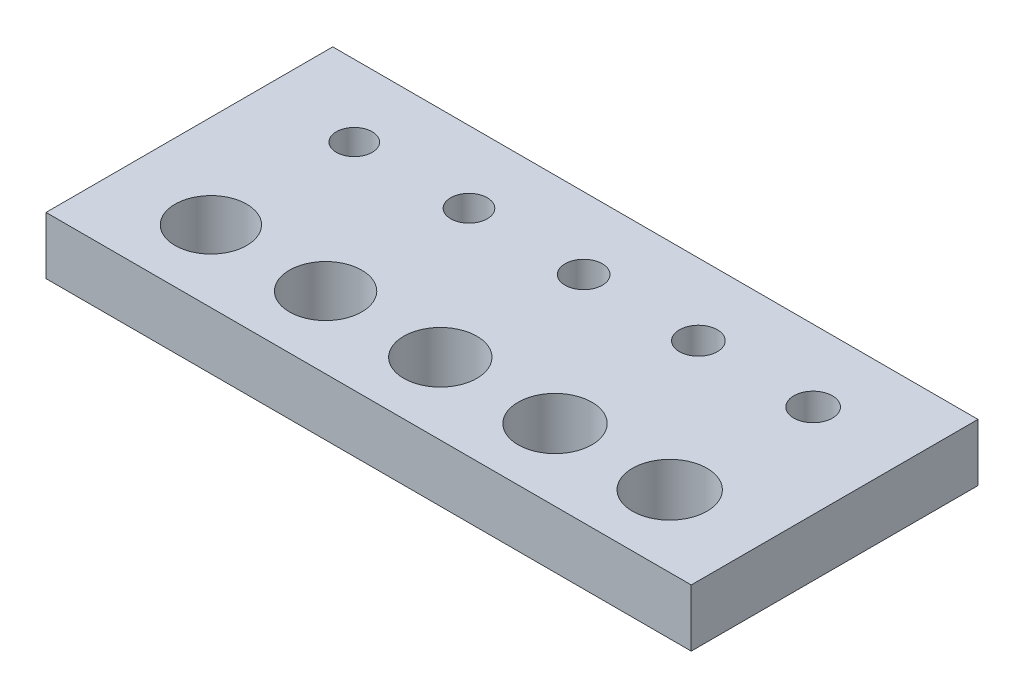
ISO-10303-21;
HEADER;
FILE_DESCRIPTION(('STEP AP214'),'2;1');
FILE_NAME('part.step','',(''),(''),'','','');
FILE_SCHEMA(('AUTOMOTIVE_DESIGN { 1 0 10303 214 1 1 1 1 }'));
ENDSEC;
DATA;
#1=APPLICATION_CONTEXT('core data for automotive mechanical design processes');
#2=APPLICATION_PROTOCOL_DEFINITION('international standard','automotive_design',2000,#1);
#3=PRODUCT_CONTEXT('',#1,'mechanical');
#4=PRODUCT('Part','Part','',(#3));
#5=PRODUCT_RELATED_PRODUCT_CATEGORY('part','',(#4));
#6=PRODUCT_DEFINITION_FORMATION('','',#4);
#7=PRODUCT_DEFINITION_CONTEXT('part definition',#1,'design');
#8=PRODUCT_DEFINITION('design','',#6,#7);
#9=PRODUCT_DEFINITION_SHAPE('','',#8);
#10=(LENGTH_UNIT() NAMED_UNIT(*) SI_UNIT(.MILLI.,.METRE.));
#11=(NAMED_UNIT(*) PLANE_ANGLE_UNIT() SI_UNIT($,.RADIAN.));
#12=(NAMED_UNIT(*) SI_UNIT($,.STERADIAN.) SOLID_ANGLE_UNIT());
#13=UNCERTAINTY_MEASURE_WITH_UNIT(LENGTH_MEASURE(1.E-05),#10,'distance_accuracy_value','');
#14=(GEOMETRIC_REPRESENTATION_CONTEXT(3) GLOBAL_UNCERTAINTY_ASSIGNED_CONTEXT((#13)) GLOBAL_UNIT_ASSIGNED_CONTEXT((#10,
#11,#12)) REPRESENTATION_CONTEXT('',''));
#15=CARTESIAN_POINT('',(0.,0.,0.));
#16=DIRECTION('',(0.,0.,1.));
#17=DIRECTION('',(1.,0.,0.));
#18=AXIS2_PLACEMENT_3D('',#15,#16,#17);
#19=CARTESIAN_POINT('',(-45.,8.,20.));
#20=DIRECTION('',(1.,0.,0.));
#21=DIRECTION('',(0.,0.,-1.));
#22=AXIS2_PLACEMENT_3D('',#19,#20,#21);
#23=PLANE('',#22);
#24=DIRECTION('',(0.,0.,1.));
#25=VECTOR('',#24,1.);
#26=CARTESIAN_POINT('',(-45.,0.,20.));
#27=LINE('',#26,#25);
#28=CARTESIAN_POINT('',(-45.,0.,-20.));
#29=VERTEX_POINT('',#28);
#30=CARTESIAN_POINT('',(-45.,0.,20.));
#31=VERTEX_POINT('',#30);
#32=EDGE_CURVE('E109',#29,#31,#27,.T.);
#33=ORIENTED_EDGE('',*,*,#32,.T.);
#34=DIRECTION('',(0.,-1.,0.));
#35=VECTOR('',#34,1.);
#36=CARTESIAN_POINT('',(-45.,8.,20.));
#37=LINE('',#36,#35);
#38=CARTESIAN_POINT('',(-45.,8.,20.));
#39=VERTEX_POINT('',#38);
#40=EDGE_CURVE('E101',#39,#31,#37,.T.);
#41=ORIENTED_EDGE('',*,*,#40,.F.);
#42=DIRECTION('',(0.,0.,1.));
#43=VECTOR('',#42,1.);
#44=CARTESIAN_POINT('',(-45.,8.,20.));
#45=LINE('',#44,#43);
#46=CARTESIAN_POINT('',(-45.,8.,-20.));
#47=VERTEX_POINT('',#46);
#48=EDGE_CURVE('E92',#47,#39,#45,.T.);
#49=ORIENTED_EDGE('',*,*,#48,.F.);
#50=DIRECTION('',(0.,-1.,0.));
#51=VECTOR('',#50,1.);
#52=CARTESIAN_POINT('',(-45.,8.,-20.));
#53=LINE('',#52,#51);
#54=EDGE_CURVE('E106',#47,#29,#53,.T.);
#55=ORIENTED_EDGE('',*,*,#54,.T.);
#56=EDGE_LOOP('',(#33,#41,#49,#55));
#57=FACE_BOUND('',#56,.T.);
#58=ADVANCED_FACE('F41',(#57),#23,.F.);
#59=CARTESIAN_POINT('',(45.,8.,20.));
#60=DIRECTION('',(0.,0.,-1.));
#61=DIRECTION('',(-1.,0.,0.));
#62=AXIS2_PLACEMENT_3D('',#59,#60,#61);
#63=PLANE('',#62);
#64=DIRECTION('',(1.,0.,0.));
#65=VECTOR('',#64,1.);
#66=CARTESIAN_POINT('',(45.,0.,20.));
#67=LINE('',#66,#65);
#68=CARTESIAN_POINT('',(45.,0.,20.));
#69=VERTEX_POINT('',#68);
#70=EDGE_CURVE('E99',#31,#69,#67,.T.);
#71=ORIENTED_EDGE('',*,*,#70,.T.);
#72=DIRECTION('',(0.,-1.,0.));
#73=VECTOR('',#72,1.);
#74=CARTESIAN_POINT('',(45.,8.,20.));
#75=LINE('',#74,#73);
#76=CARTESIAN_POINT('',(45.,8.,20.));
#77=VERTEX_POINT('',#76);
#78=EDGE_CURVE('E98',#77,#69,#75,.T.);
#79=ORIENTED_EDGE('',*,*,#78,.F.);
#80=DIRECTION('',(1.,0.,0.));
#81=VECTOR('',#80,1.);
#82=CARTESIAN_POINT('',(45.,8.,20.));
#83=LINE('',#82,#81);
#84=EDGE_CURVE('E89',#39,#77,#83,.T.);
#85=ORIENTED_EDGE('',*,*,#84,.F.);
#86=ORIENTED_EDGE('',*,*,#40,.T.);
#87=EDGE_LOOP('',(#71,#79,#85,#86));
#88=FACE_BOUND('',#87,.T.);
#89=ADVANCED_FACE('F97',(#88),#63,.F.);
#90=CARTESIAN_POINT('',(45.,8.,20.));
#91=DIRECTION('',(-1.,0.,0.));
#92=DIRECTION('',(0.,0.,1.));
#93=AXIS2_PLACEMENT_3D('',#90,#91,#92);
#94=PLANE('',#93);
#95=DIRECTION('',(0.,0.,-1.));
#96=VECTOR('',#95,1.);
#97=CARTESIAN_POINT('',(45.,0.,20.));
#98=LINE('',#97,#96);
#99=CARTESIAN_POINT('',(45.,0.,-20.));
#100=VERTEX_POINT('',#99);
#101=EDGE_CURVE('E77',#69,#100,#98,.T.);
#102=ORIENTED_EDGE('',*,*,#101,.T.);
#103=DIRECTION('',(0.,-1.,0.));
#104=VECTOR('',#103,1.);
#105=CARTESIAN_POINT('',(45.,8.,-20.));
#106=LINE('',#105,#104);
#107=CARTESIAN_POINT('',(45.,8.,-20.));
#108=VERTEX_POINT('',#107);
#109=EDGE_CURVE('E105',#108,#100,#106,.T.);
#110=ORIENTED_EDGE('',*,*,#109,.F.);
#111=DIRECTION('',(0.,0.,-1.));
#112=VECTOR('',#111,1.);
#113=CARTESIAN_POINT('',(45.,8.,20.));
#114=LINE('',#113,#112);
#115=EDGE_CURVE('E91',#77,#108,#114,.T.);
#116=ORIENTED_EDGE('',*,*,#115,.F.);
#117=ORIENTED_EDGE('',*,*,#78,.T.);
#118=EDGE_LOOP('',(#102,#110,#116,#117));
#119=FACE_BOUND('',#118,.T.);
#120=ADVANCED_FACE('F102',(#119),#94,.F.);
#121=CARTESIAN_POINT('',(45.,8.,-20.));
#122=DIRECTION('',(0.,0.,1.));
#123=DIRECTION('',(1.,0.,0.));
#124=AXIS2_PLACEMENT_3D('',#121,#122,#123);
#125=PLANE('',#124);
#126=DIRECTION('',(-1.,0.,0.));
#127=VECTOR('',#126,1.);
#128=CARTESIAN_POINT('',(45.,0.,-20.));
#129=LINE('',#128,#127);
#130=EDGE_CURVE('E85',#100,#29,#129,.T.);
#131=ORIENTED_EDGE('',*,*,#130,.T.);
#132=ORIENTED_EDGE('',*,*,#54,.F.);
#133=DIRECTION('',(-1.,0.,0.));
#134=VECTOR('',#133,1.);
#135=CARTESIAN_POINT('',(45.,8.,-20.));
#136=LINE('',#135,#134);
#137=EDGE_CURVE('E56',#108,#47,#136,.T.);
#138=ORIENTED_EDGE('',*,*,#137,.F.);
#139=ORIENTED_EDGE('',*,*,#109,.T.);
#140=EDGE_LOOP('',(#131,#132,#138,#139));
#141=FACE_BOUND('',#140,.T.);
#142=ADVANCED_FACE('F191',(#141),#125,.F.);
#143=CARTESIAN_POINT('',(0.,8.,0.));
#144=DIRECTION('',(0.,1.,0.));
#145=DIRECTION('',(0.,0.,1.));
#146=AXIS2_PLACEMENT_3D('',#143,#144,#145);
#147=PLANE('',#146);
#148=CARTESIAN_POINT('',(-16.,8.,-10.));
#149=DIRECTION('',(0.,1.,0.));
#150=DIRECTION('',(0.,0.,1.));
#151=AXIS2_PLACEMENT_3D('',#148,#149,#150);
#152=CIRCLE('',#151,2.55);
#153=CARTESIAN_POINT('',(-16.,8.,-7.45));
#154=VERTEX_POINT('',#153);
#155=EDGE_CURVE('E298',#154,#154,#152,.T.);
#156=ORIENTED_EDGE('',*,*,#155,.F.);
#157=EDGE_LOOP('',(#156));
#158=FACE_BOUND('',#157,.T.);
#159=CARTESIAN_POINT('',(0.,8.,-10.));
#160=DIRECTION('',(0.,1.,0.));
#161=DIRECTION('',(0.,0.,1.));
#162=AXIS2_PLACEMENT_3D('',#159,#160,#161);
#163=CIRCLE('',#162,2.6);
#164=CARTESIAN_POINT('',(0.,8.,-7.4));
#165=VERTEX_POINT('',#164);
#166=EDGE_CURVE('E304',#165,#165,#163,.T.);
#167=ORIENTED_EDGE('',*,*,#166,.F.);
#168=EDGE_LOOP('',(#167));
#169=FACE_BOUND('',#168,.T.);
#170=CARTESIAN_POINT('',(16.,8.,-10.));
#171=DIRECTION('',(0.,1.,0.));
#172=DIRECTION('',(0.,0.,1.));
#173=AXIS2_PLACEMENT_3D('',#170,#171,#172);
#174=CIRCLE('',#173,2.65);
#175=CARTESIAN_POINT('',(16.,8.,-7.35));
#176=VERTEX_POINT('',#175);
#177=EDGE_CURVE('E310',#176,#176,#174,.T.);
#178=ORIENTED_EDGE('',*,*,#177,.F.);
#179=EDGE_LOOP('',(#178));
#180=FACE_BOUND('',#179,.T.);
#181=CARTESIAN_POINT('',(32.,8.,-10.));
#182=DIRECTION('',(0.,1.,0.));
#183=DIRECTION('',(0.,0.,1.));
#184=AXIS2_PLACEMENT_3D('',#181,#182,#183);
#185=CIRCLE('',#184,2.7);
#186=CARTESIAN_POINT('',(32.,8.,-7.3));
#187=VERTEX_POINT('',#186);
#188=EDGE_CURVE('E312',#187,#187,#185,.T.);
#189=ORIENTED_EDGE('',*,*,#188,.F.);
#190=EDGE_LOOP('',(#189));
#191=FACE_BOUND('',#190,.T.);
#192=CARTESIAN_POINT('',(-32.,8.,10.));
#193=DIRECTION('',(0.,1.,0.));
#194=DIRECTION('',(0.,0.,1.));
#195=AXIS2_PLACEMENT_3D('',#192,#193,#194);
#196=CIRCLE('',#195,5.);
#197=CARTESIAN_POINT('',(-32.,8.,15.));
#198=VERTEX_POINT('',#197);
#199=EDGE_CURVE('E295',#198,#198,#196,.T.);
#200=ORIENTED_EDGE('',*,*,#199,.F.);
#201=EDGE_LOOP('',(#200));
#202=FACE_BOUND('',#201,.T.);
#203=CARTESIAN_POINT('',(-16.,8.,10.));
#204=DIRECTION('',(0.,1.,0.));
#205=DIRECTION('',(0.,0.,1.));
#206=AXIS2_PLACEMENT_3D('',#203,#204,#205);
#207=CIRCLE('',#206,5.05);
#208=CARTESIAN_POINT('',(-16.,8.,15.05));
#209=VERTEX_POINT('',#208);
#210=EDGE_CURVE('E288',#209,#209,#207,.T.);
#211=ORIENTED_EDGE('',*,*,#210,.F.);
#212=EDGE_LOOP('',(#211));
#213=FACE_BOUND('',#212,.T.);
#214=CARTESIAN_POINT('',(0.,8.,10.));
#215=DIRECTION('',(0.,1.,0.));
#216=DIRECTION('',(0.,0.,1.));
#217=AXIS2_PLACEMENT_3D('',#214,#215,#216);
#218=CIRCLE('',#217,5.1);
#219=CARTESIAN_POINT('',(0.,8.,15.1));
#220=VERTEX_POINT('',#219);
#221=EDGE_CURVE('E287',#220,#220,#218,.T.);
#222=ORIENTED_EDGE('',*,*,#221,.F.);
#223=EDGE_LOOP('',(#222));
#224=FACE_BOUND('',#223,.T.);
#225=CARTESIAN_POINT('',(16.,8.,10.));
#226=DIRECTION('',(0.,1.,0.));
#227=DIRECTION('',(0.,0.,1.));
#228=AXIS2_PLACEMENT_3D('',#225,#226,#227);
#229=CIRCLE('',#228,5.15);
#230=CARTESIAN_POINT('',(16.,8.,15.15));
#231=VERTEX_POINT('',#230);
#232=EDGE_CURVE('E289',#231,#231,#229,.T.);
#233=ORIENTED_EDGE('',*,*,#232,.F.);
#234=EDGE_LOOP('',(#233));
#235=FACE_BOUND('',#234,.T.);
#236=CARTESIAN_POINT('',(32.,8.,10.));
#237=DIRECTION('',(0.,1.,0.));
#238=DIRECTION('',(0.,0.,1.));
#239=AXIS2_PLACEMENT_3D('',#236,#237,#238);
#240=CIRCLE('',#239,5.2);
#241=CARTESIAN_POINT('',(32.,8.,15.2));
#242=VERTEX_POINT('',#241);
#243=EDGE_CURVE('E293',#242,#242,#240,.T.);
#244=ORIENTED_EDGE('',*,*,#243,.F.);
#245=EDGE_LOOP('',(#244));
#246=FACE_BOUND('',#245,.T.);
#247=CARTESIAN_POINT('',(-32.,8.,-10.));
#248=DIRECTION('',(0.,1.,0.));
#249=DIRECTION('',(0.,0.,1.));
#250=AXIS2_PLACEMENT_3D('',#247,#248,#249);
#251=CIRCLE('',#250,2.5);
#252=CARTESIAN_POINT('',(-32.,8.,-7.5));
#253=VERTEX_POINT('',#252);
#254=EDGE_CURVE('E114',#253,#253,#251,.T.);
#255=ORIENTED_EDGE('',*,*,#254,.F.);
#256=EDGE_LOOP('',(#255));
#257=FACE_BOUND('',#256,.T.);
#258=ORIENTED_EDGE('',*,*,#48,.T.);
#259=ORIENTED_EDGE('',*,*,#84,.T.);
#260=ORIENTED_EDGE('',*,*,#115,.T.);
#261=ORIENTED_EDGE('',*,*,#137,.T.);
#262=EDGE_LOOP('',(#258,#259,#260,#261));
#263=FACE_BOUND('',#262,.T.);
#264=ADVANCED_FACE('F93',(#158,#169,#180,#191,#202,#213,#224,#235,#246,#257,#263),#147,.T.);
#265=CARTESIAN_POINT('',(0.,0.,0.));
#266=DIRECTION('',(0.,1.,0.));
#267=DIRECTION('',(0.,0.,1.));
#268=AXIS2_PLACEMENT_3D('',#265,#266,#267);
#269=PLANE('',#268);
#270=CARTESIAN_POINT('',(-32.,0.,-10.));
#271=DIRECTION('',(0.,1.,0.));
#272=DIRECTION('',(0.,0.,1.));
#273=AXIS2_PLACEMENT_3D('',#270,#271,#272);
#274=CIRCLE('',#273,3.);
#275=CARTESIAN_POINT('',(-32.,0.,-7.));
#276=VERTEX_POINT('',#275);
#277=EDGE_CURVE('E150',#276,#276,#274,.T.);
#278=ORIENTED_EDGE('',*,*,#277,.T.);
#279=EDGE_LOOP('',(#278));
#280=FACE_BOUND('',#279,.T.);
#281=CARTESIAN_POINT('',(-16.,0.,-10.));
#282=DIRECTION('',(0.,1.,0.));
#283=DIRECTION('',(0.,0.,1.));
#284=AXIS2_PLACEMENT_3D('',#281,#282,#283);
#285=CIRCLE('',#284,3.05000000000001);
#286=CARTESIAN_POINT('',(-16.,0.,-6.94999999999999));
#287=VERTEX_POINT('',#286);
#288=EDGE_CURVE('E145',#287,#287,#285,.T.);
#289=ORIENTED_EDGE('',*,*,#288,.T.);
#290=EDGE_LOOP('',(#289));
#291=FACE_BOUND('',#290,.T.);
#292=CARTESIAN_POINT('',(0.,0.,-10.));
#293=DIRECTION('',(0.,1.,0.));
#294=DIRECTION('',(0.,0.,1.));
#295=AXIS2_PLACEMENT_3D('',#292,#293,#294);
#296=CIRCLE('',#295,3.10000000000001);
#297=CARTESIAN_POINT('',(0.,0.,-6.9));
#298=VERTEX_POINT('',#297);
#299=EDGE_CURVE('E143',#298,#298,#296,.T.);
#300=ORIENTED_EDGE('',*,*,#299,.T.);
#301=EDGE_LOOP('',(#300));
#302=FACE_BOUND('',#301,.T.);
#303=CARTESIAN_POINT('',(16.,0.,-10.));
#304=DIRECTION('',(0.,1.,0.));
#305=DIRECTION('',(0.,0.,1.));
#306=AXIS2_PLACEMENT_3D('',#303,#304,#305);
#307=CIRCLE('',#306,3.15);
#308=CARTESIAN_POINT('',(16.,0.,-6.85));
#309=VERTEX_POINT('',#308);
#310=EDGE_CURVE('E138',#309,#309,#307,.T.);
#311=ORIENTED_EDGE('',*,*,#310,.T.);
#312=EDGE_LOOP('',(#311));
#313=FACE_BOUND('',#312,.T.);
#314=CARTESIAN_POINT('',(32.,0.,-10.));
#315=DIRECTION('',(0.,1.,0.));
#316=DIRECTION('',(0.,0.,1.));
#317=AXIS2_PLACEMENT_3D('',#314,#315,#316);
#318=CIRCLE('',#317,3.19999999999999);
#319=CARTESIAN_POINT('',(32.,0.,-6.80000000000001));
#320=VERTEX_POINT('',#319);
#321=EDGE_CURVE('E133',#320,#320,#318,.T.);
#322=ORIENTED_EDGE('',*,*,#321,.T.);
#323=EDGE_LOOP('',(#322));
#324=FACE_BOUND('',#323,.T.);
#325=CARTESIAN_POINT('',(32.,0.,10.));
#326=DIRECTION('',(0.,1.,0.));
#327=DIRECTION('',(0.,0.,1.));
#328=AXIS2_PLACEMENT_3D('',#325,#326,#327);
#329=CIRCLE('',#328,5.69999999999999);
#330=CARTESIAN_POINT('',(32.,0.,15.7));
#331=VERTEX_POINT('',#330);
#332=EDGE_CURVE('E135',#331,#331,#329,.T.);
#333=ORIENTED_EDGE('',*,*,#332,.T.);
#334=EDGE_LOOP('',(#333));
#335=FACE_BOUND('',#334,.T.);
#336=CARTESIAN_POINT('',(16.,0.,10.));
#337=DIRECTION('',(0.,1.,0.));
#338=DIRECTION('',(0.,0.,1.));
#339=AXIS2_PLACEMENT_3D('',#336,#337,#338);
#340=CIRCLE('',#339,5.65);
#341=CARTESIAN_POINT('',(16.,0.,15.65));
#342=VERTEX_POINT('',#341);
#343=EDGE_CURVE('E129',#342,#342,#340,.T.);
#344=ORIENTED_EDGE('',*,*,#343,.T.);
#345=EDGE_LOOP('',(#344));
#346=FACE_BOUND('',#345,.T.);
#347=CARTESIAN_POINT('',(0.,0.,10.));
#348=DIRECTION('',(0.,1.,0.));
#349=DIRECTION('',(0.,0.,1.));
#350=AXIS2_PLACEMENT_3D('',#347,#348,#349);
#351=CIRCLE('',#350,5.59999999999998);
#352=CARTESIAN_POINT('',(0.,0.,15.6));
#353=VERTEX_POINT('',#352);
#354=EDGE_CURVE('E127',#353,#353,#351,.T.);
#355=ORIENTED_EDGE('',*,*,#354,.T.);
#356=EDGE_LOOP('',(#355));
#357=FACE_BOUND('',#356,.T.);
#358=CARTESIAN_POINT('',(-16.,0.,10.));
#359=DIRECTION('',(0.,1.,0.));
#360=DIRECTION('',(0.,0.,1.));
#361=AXIS2_PLACEMENT_3D('',#358,#359,#360);
#362=CIRCLE('',#361,5.54999999999999);
#363=CARTESIAN_POINT('',(-16.,0.,15.55));
#364=VERTEX_POINT('',#363);
#365=EDGE_CURVE('E123',#364,#364,#362,.T.);
#366=ORIENTED_EDGE('',*,*,#365,.T.);
#367=EDGE_LOOP('',(#366));
#368=FACE_BOUND('',#367,.T.);
#369=CARTESIAN_POINT('',(-32.,0.,10.));
#370=DIRECTION('',(0.,1.,0.));
#371=DIRECTION('',(0.,0.,1.));
#372=AXIS2_PLACEMENT_3D('',#369,#370,#371);
#373=CIRCLE('',#372,5.49999999999999);
#374=CARTESIAN_POINT('',(-32.,0.,15.5));
#375=VERTEX_POINT('',#374);
#376=EDGE_CURVE('E118',#375,#375,#373,.T.);
#377=ORIENTED_EDGE('',*,*,#376,.T.);
#378=EDGE_LOOP('',(#377));
#379=FACE_BOUND('',#378,.T.);
#380=ORIENTED_EDGE('',*,*,#32,.F.);
#381=ORIENTED_EDGE('',*,*,#130,.F.);
#382=ORIENTED_EDGE('',*,*,#101,.F.);
#383=ORIENTED_EDGE('',*,*,#70,.F.);
#384=EDGE_LOOP('',(#380,#381,#382,#383));
#385=FACE_BOUND('',#384,.T.);
#386=ADVANCED_FACE('F183',(#280,#291,#302,#313,#324,#335,#346,#357,#368,#379,#385),#269,.F.);
#387=CARTESIAN_POINT('',(-32.,0.,-10.));
#388=DIRECTION('',(0.,1.,0.));
#389=DIRECTION('',(0.,0.,1.));
#390=AXIS2_PLACEMENT_3D('',#387,#388,#389);
#391=CYLINDRICAL_SURFACE('',#390,2.5);
#392=CARTESIAN_POINT('',(-32.,0.499999999999995,-10.));
#393=DIRECTION('',(0.,1.,0.));
#394=DIRECTION('',(0.,0.,1.));
#395=AXIS2_PLACEMENT_3D('',#392,#393,#394);
#396=CIRCLE('',#395,2.5);
#397=CARTESIAN_POINT('',(-32.,0.499999999999995,-7.5));
#398=VERTEX_POINT('',#397);
#399=EDGE_CURVE('E147',#398,#398,#396,.F.);
#400=ORIENTED_EDGE('',*,*,#399,.T.);
#401=EDGE_LOOP('',(#400));
#402=FACE_BOUND('',#401,.T.);
#403=ORIENTED_EDGE('',*,*,#254,.T.);
#404=EDGE_LOOP('',(#403));
#405=FACE_BOUND('',#404,.T.);
#406=ADVANCED_FACE('F189',(#402,#405),#391,.F.);
#407=CARTESIAN_POINT('',(32.,0.,10.));
#408=DIRECTION('',(0.,1.,0.));
#409=DIRECTION('',(0.,0.,1.));
#410=AXIS2_PLACEMENT_3D('',#407,#408,#409);
#411=CYLINDRICAL_SURFACE('',#410,5.2);
#412=CARTESIAN_POINT('',(32.,0.499999999999994,10.));
#413=DIRECTION('',(0.,1.,0.));
#414=DIRECTION('',(0.,0.,1.));
#415=AXIS2_PLACEMENT_3D('',#412,#413,#414);
#416=CIRCLE('',#415,5.2);
#417=CARTESIAN_POINT('',(32.,0.499999999999994,15.2));
#418=VERTEX_POINT('',#417);
#419=EDGE_CURVE('E164',#418,#418,#416,.F.);
#420=ORIENTED_EDGE('',*,*,#419,.T.);
#421=EDGE_LOOP('',(#420));
#422=FACE_BOUND('',#421,.T.);
#423=ORIENTED_EDGE('',*,*,#243,.T.);
#424=EDGE_LOOP('',(#423));
#425=FACE_BOUND('',#424,.T.);
#426=ADVANCED_FACE('F332',(#422,#425),#411,.F.);
#427=CARTESIAN_POINT('',(16.,0.,10.));
#428=DIRECTION('',(0.,1.,0.));
#429=DIRECTION('',(0.,0.,1.));
#430=AXIS2_PLACEMENT_3D('',#427,#428,#429);
#431=CYLINDRICAL_SURFACE('',#430,5.15);
#432=CARTESIAN_POINT('',(16.,0.499999999999995,10.));
#433=DIRECTION('',(0.,1.,0.));
#434=DIRECTION('',(0.,0.,1.));
#435=AXIS2_PLACEMENT_3D('',#432,#433,#434);
#436=CIRCLE('',#435,5.15);
#437=CARTESIAN_POINT('',(16.,0.499999999999995,15.15));
#438=VERTEX_POINT('',#437);
#439=EDGE_CURVE('E169',#438,#438,#436,.F.);
#440=ORIENTED_EDGE('',*,*,#439,.T.);
#441=EDGE_LOOP('',(#440));
#442=FACE_BOUND('',#441,.T.);
#443=ORIENTED_EDGE('',*,*,#232,.T.);
#444=EDGE_LOOP('',(#443));
#445=FACE_BOUND('',#444,.T.);
#446=ADVANCED_FACE('F285',(#442,#445),#431,.F.);
#447=CARTESIAN_POINT('',(0.,0.,10.));
#448=DIRECTION('',(0.,1.,0.));
#449=DIRECTION('',(0.,0.,1.));
#450=AXIS2_PLACEMENT_3D('',#447,#448,#449);
#451=CYLINDRICAL_SURFACE('',#450,5.1);
#452=CARTESIAN_POINT('',(0.,0.499999999999976,10.));
#453=DIRECTION('',(0.,1.,0.));
#454=DIRECTION('',(0.,0.,1.));
#455=AXIS2_PLACEMENT_3D('',#452,#453,#454);
#456=CIRCLE('',#455,5.1);
#457=CARTESIAN_POINT('',(0.,0.499999999999976,15.1));
#458=VERTEX_POINT('',#457);
#459=EDGE_CURVE('E172',#458,#458,#456,.F.);
#460=ORIENTED_EDGE('',*,*,#459,.T.);
#461=EDGE_LOOP('',(#460));
#462=FACE_BOUND('',#461,.T.);
#463=ORIENTED_EDGE('',*,*,#221,.T.);
#464=EDGE_LOOP('',(#463));
#465=FACE_BOUND('',#464,.T.);
#466=ADVANCED_FACE('F276',(#462,#465),#451,.F.);
#467=CARTESIAN_POINT('',(-16.,0.,10.));
#468=DIRECTION('',(0.,1.,0.));
#469=DIRECTION('',(0.,0.,1.));
#470=AXIS2_PLACEMENT_3D('',#467,#468,#469);
#471=CYLINDRICAL_SURFACE('',#470,5.05);
#472=CARTESIAN_POINT('',(-16.,0.499999999999982,10.));
#473=DIRECTION('',(0.,1.,0.));
#474=DIRECTION('',(0.,0.,1.));
#475=AXIS2_PLACEMENT_3D('',#472,#473,#474);
#476=CIRCLE('',#475,5.05);
#477=CARTESIAN_POINT('',(-16.,0.499999999999982,15.05));
#478=VERTEX_POINT('',#477);
#479=EDGE_CURVE('E51',#478,#478,#476,.F.);
#480=ORIENTED_EDGE('',*,*,#479,.T.);
#481=EDGE_LOOP('',(#480));
#482=FACE_BOUND('',#481,.T.);
#483=ORIENTED_EDGE('',*,*,#210,.T.);
#484=EDGE_LOOP('',(#483));
#485=FACE_BOUND('',#484,.T.);
#486=ADVANCED_FACE('F177',(#482,#485),#471,.F.);
#487=CARTESIAN_POINT('',(-32.,0.,10.));
#488=DIRECTION('',(0.,1.,0.));
#489=DIRECTION('',(0.,0.,1.));
#490=AXIS2_PLACEMENT_3D('',#487,#488,#489);
#491=CYLINDRICAL_SURFACE('',#490,5.);
#492=CARTESIAN_POINT('',(-32.,0.499999999999987,10.));
#493=DIRECTION('',(0.,1.,0.));
#494=DIRECTION('',(0.,0.,1.));
#495=AXIS2_PLACEMENT_3D('',#492,#493,#494);
#496=CIRCLE('',#495,5.);
#497=CARTESIAN_POINT('',(-32.,0.499999999999987,15.));
#498=VERTEX_POINT('',#497);
#499=EDGE_CURVE('E11',#498,#498,#496,.F.);
#500=ORIENTED_EDGE('',*,*,#499,.T.);
#501=EDGE_LOOP('',(#500));
#502=FACE_BOUND('',#501,.T.);
#503=ORIENTED_EDGE('',*,*,#199,.T.);
#504=EDGE_LOOP('',(#503));
#505=FACE_BOUND('',#504,.T.);
#506=ADVANCED_FACE('F319',(#502,#505),#491,.F.);
#507=CARTESIAN_POINT('',(32.,0.,-10.));
#508=DIRECTION('',(0.,1.,0.));
#509=DIRECTION('',(0.,0.,1.));
#510=AXIS2_PLACEMENT_3D('',#507,#508,#509);
#511=CYLINDRICAL_SURFACE('',#510,2.7);
#512=CARTESIAN_POINT('',(32.,0.499999999999988,-10.));
#513=DIRECTION('',(0.,1.,0.));
#514=DIRECTION('',(0.,0.,1.));
#515=AXIS2_PLACEMENT_3D('',#512,#513,#514);
#516=CIRCLE('',#515,2.7);
#517=CARTESIAN_POINT('',(32.,0.499999999999988,-7.3));
#518=VERTEX_POINT('',#517);
#519=EDGE_CURVE('E165',#518,#518,#516,.F.);
#520=ORIENTED_EDGE('',*,*,#519,.T.);
#521=EDGE_LOOP('',(#520));
#522=FACE_BOUND('',#521,.T.);
#523=ORIENTED_EDGE('',*,*,#188,.T.);
#524=EDGE_LOOP('',(#523));
#525=FACE_BOUND('',#524,.T.);
#526=ADVANCED_FACE('F351',(#522,#525),#511,.F.);
#527=CARTESIAN_POINT('',(16.,0.,-10.));
#528=DIRECTION('',(0.,1.,0.));
#529=DIRECTION('',(0.,0.,1.));
#530=AXIS2_PLACEMENT_3D('',#527,#528,#529);
#531=CYLINDRICAL_SURFACE('',#530,2.65);
#532=CARTESIAN_POINT('',(16.,0.499999999999991,-10.));
#533=DIRECTION('',(0.,1.,0.));
#534=DIRECTION('',(0.,0.,1.));
#535=AXIS2_PLACEMENT_3D('',#532,#533,#534);
#536=CIRCLE('',#535,2.65);
#537=CARTESIAN_POINT('',(16.,0.499999999999991,-7.35));
#538=VERTEX_POINT('',#537);
#539=EDGE_CURVE('E157',#538,#538,#536,.F.);
#540=ORIENTED_EDGE('',*,*,#539,.T.);
#541=EDGE_LOOP('',(#540));
#542=FACE_BOUND('',#541,.T.);
#543=ORIENTED_EDGE('',*,*,#177,.T.);
#544=EDGE_LOOP('',(#543));
#545=FACE_BOUND('',#544,.T.);
#546=ADVANCED_FACE('F348',(#542,#545),#531,.F.);
#547=CARTESIAN_POINT('',(0.,0.,-10.));
#548=DIRECTION('',(0.,1.,0.));
#549=DIRECTION('',(0.,0.,1.));
#550=AXIS2_PLACEMENT_3D('',#547,#548,#549);
#551=CYLINDRICAL_SURFACE('',#550,2.6);
#552=CARTESIAN_POINT('',(0.,0.499999999999997,-10.));
#553=DIRECTION('',(0.,1.,0.));
#554=DIRECTION('',(0.,0.,1.));
#555=AXIS2_PLACEMENT_3D('',#552,#553,#554);
#556=CIRCLE('',#555,2.6);
#557=CARTESIAN_POINT('',(0.,0.499999999999997,-7.4));
#558=VERTEX_POINT('',#557);
#559=EDGE_CURVE('E156',#558,#558,#556,.F.);
#560=ORIENTED_EDGE('',*,*,#559,.T.);
#561=EDGE_LOOP('',(#560));
#562=FACE_BOUND('',#561,.T.);
#563=ORIENTED_EDGE('',*,*,#166,.T.);
#564=EDGE_LOOP('',(#563));
#565=FACE_BOUND('',#564,.T.);
#566=ADVANCED_FACE('F347',(#562,#565),#551,.F.);
#567=CARTESIAN_POINT('',(-16.,0.,-10.));
#568=DIRECTION('',(0.,1.,0.));
#569=DIRECTION('',(0.,0.,1.));
#570=AXIS2_PLACEMENT_3D('',#567,#568,#569);
#571=CYLINDRICAL_SURFACE('',#570,2.55);
#572=CARTESIAN_POINT('',(-16.,0.500000000000002,-10.));
#573=DIRECTION('',(0.,1.,0.));
#574=DIRECTION('',(0.,0.,1.));
#575=AXIS2_PLACEMENT_3D('',#572,#573,#574);
#576=CIRCLE('',#575,2.55);
#577=CARTESIAN_POINT('',(-16.,0.500000000000002,-7.45));
#578=VERTEX_POINT('',#577);
#579=EDGE_CURVE('E153',#578,#578,#576,.F.);
#580=ORIENTED_EDGE('',*,*,#579,.T.);
#581=EDGE_LOOP('',(#580));
#582=FACE_BOUND('',#581,.T.);
#583=ORIENTED_EDGE('',*,*,#155,.T.);
#584=EDGE_LOOP('',(#583));
#585=FACE_BOUND('',#584,.T.);
#586=ADVANCED_FACE('F219',(#582,#585),#571,.F.);
#587=CARTESIAN_POINT('',(-32.,0.,-10.));
#588=DIRECTION('',(0.,-1.,0.));
#589=DIRECTION('',(0.,0.,-1.));
#590=AXIS2_PLACEMENT_3D('',#587,#588,#589);
#591=CONICAL_SURFACE('',#590,3.,0.785398163397457);
#592=ORIENTED_EDGE('',*,*,#399,.F.);
#593=EDGE_LOOP('',(#592));
#594=FACE_BOUND('',#593,.T.);
#595=ORIENTED_EDGE('',*,*,#277,.F.);
#596=EDGE_LOOP('',(#595));
#597=FACE_BOUND('',#596,.T.);
#598=ADVANCED_FACE('F213',(#594,#597),#591,.F.);
#599=CARTESIAN_POINT('',(-16.,0.,-10.));
#600=DIRECTION('',(0.,-1.,0.));
#601=DIRECTION('',(0.,0.,-1.));
#602=AXIS2_PLACEMENT_3D('',#599,#600,#601);
#603=CONICAL_SURFACE('',#602,3.05000000000001,0.785398163397457);
#604=ORIENTED_EDGE('',*,*,#579,.F.);
#605=EDGE_LOOP('',(#604));
#606=FACE_BOUND('',#605,.T.);
#607=ORIENTED_EDGE('',*,*,#288,.F.);
#608=EDGE_LOOP('',(#607));
#609=FACE_BOUND('',#608,.T.);
#610=ADVANCED_FACE('F218',(#606,#609),#603,.F.);
#611=CARTESIAN_POINT('',(0.,0.,-10.));
#612=DIRECTION('',(0.,-1.,0.));
#613=DIRECTION('',(0.,0.,-1.));
#614=AXIS2_PLACEMENT_3D('',#611,#612,#613);
#615=CONICAL_SURFACE('',#614,3.10000000000001,0.785398163397457);
#616=ORIENTED_EDGE('',*,*,#559,.F.);
#617=EDGE_LOOP('',(#616));
#618=FACE_BOUND('',#617,.T.);
#619=ORIENTED_EDGE('',*,*,#299,.F.);
#620=EDGE_LOOP('',(#619));
#621=FACE_BOUND('',#620,.T.);
#622=ADVANCED_FACE('F230',(#618,#621),#615,.F.);
#623=CARTESIAN_POINT('',(16.,0.,-10.));
#624=DIRECTION('',(0.,-1.,0.));
#625=DIRECTION('',(0.,0.,-1.));
#626=AXIS2_PLACEMENT_3D('',#623,#624,#625);
#627=CONICAL_SURFACE('',#626,3.15,0.785398163397457);
#628=ORIENTED_EDGE('',*,*,#539,.F.);
#629=EDGE_LOOP('',(#628));
#630=FACE_BOUND('',#629,.T.);
#631=ORIENTED_EDGE('',*,*,#310,.F.);
#632=EDGE_LOOP('',(#631));
#633=FACE_BOUND('',#632,.T.);
#634=ADVANCED_FACE('F234',(#630,#633),#627,.F.);
#635=CARTESIAN_POINT('',(32.,0.,-10.));
#636=DIRECTION('',(0.,-1.,0.));
#637=DIRECTION('',(0.,0.,-1.));
#638=AXIS2_PLACEMENT_3D('',#635,#636,#637);
#639=CONICAL_SURFACE('',#638,3.19999999999999,0.785398163397457);
#640=ORIENTED_EDGE('',*,*,#519,.F.);
#641=EDGE_LOOP('',(#640));
#642=FACE_BOUND('',#641,.T.);
#643=ORIENTED_EDGE('',*,*,#321,.F.);
#644=EDGE_LOOP('',(#643));
#645=FACE_BOUND('',#644,.T.);
#646=ADVANCED_FACE('F242',(#642,#645),#639,.F.);
#647=CARTESIAN_POINT('',(32.,0.,10.));
#648=DIRECTION('',(0.,-1.,0.));
#649=DIRECTION('',(0.,0.,-1.));
#650=AXIS2_PLACEMENT_3D('',#647,#648,#649);
#651=CONICAL_SURFACE('',#650,5.7,0.785398163397453);
#652=ORIENTED_EDGE('',*,*,#419,.F.);
#653=EDGE_LOOP('',(#652));
#654=FACE_BOUND('',#653,.T.);
#655=ORIENTED_EDGE('',*,*,#332,.F.);
#656=EDGE_LOOP('',(#655));
#657=FACE_BOUND('',#656,.T.);
#658=ADVANCED_FACE('F248',(#654,#657),#651,.F.);
#659=CARTESIAN_POINT('',(16.,0.,10.));
#660=DIRECTION('',(0.,-1.,0.));
#661=DIRECTION('',(0.,0.,-1.));
#662=AXIS2_PLACEMENT_3D('',#659,#660,#661);
#663=CONICAL_SURFACE('',#662,5.65,0.785398163397453);
#664=ORIENTED_EDGE('',*,*,#439,.F.);
#665=EDGE_LOOP('',(#664));
#666=FACE_BOUND('',#665,.T.);
#667=ORIENTED_EDGE('',*,*,#343,.F.);
#668=EDGE_LOOP('',(#667));
#669=FACE_BOUND('',#668,.T.);
#670=ADVANCED_FACE('F254',(#666,#669),#663,.F.);
#671=CARTESIAN_POINT('',(0.,0.,10.));
#672=DIRECTION('',(0.,-1.,0.));
#673=DIRECTION('',(0.,0.,-1.));
#674=AXIS2_PLACEMENT_3D('',#671,#672,#673);
#675=CONICAL_SURFACE('',#674,5.59999999999998,0.785398163397453);
#676=ORIENTED_EDGE('',*,*,#459,.F.);
#677=EDGE_LOOP('',(#676));
#678=FACE_BOUND('',#677,.T.);
#679=ORIENTED_EDGE('',*,*,#354,.F.);
#680=EDGE_LOOP('',(#679));
#681=FACE_BOUND('',#680,.T.);
#682=ADVANCED_FACE('F185',(#678,#681),#675,.F.);
#683=CARTESIAN_POINT('',(-16.,0.,10.));
#684=DIRECTION('',(0.,-1.,0.));
#685=DIRECTION('',(0.,0.,-1.));
#686=AXIS2_PLACEMENT_3D('',#683,#684,#685);
#687=CONICAL_SURFACE('',#686,5.54999999999999,0.785398163397452);
#688=ORIENTED_EDGE('',*,*,#479,.F.);
#689=EDGE_LOOP('',(#688));
#690=FACE_BOUND('',#689,.T.);
#691=ORIENTED_EDGE('',*,*,#365,.F.);
#692=EDGE_LOOP('',(#691));
#693=FACE_BOUND('',#692,.T.);
#694=ADVANCED_FACE('F179',(#690,#693),#687,.F.);
#695=CARTESIAN_POINT('',(-32.,0.,10.));
#696=DIRECTION('',(0.,-1.,0.));
#697=DIRECTION('',(0.,0.,-1.));
#698=AXIS2_PLACEMENT_3D('',#695,#696,#697);
#699=CONICAL_SURFACE('',#698,5.49999999999999,0.785398163397452);
#700=ORIENTED_EDGE('',*,*,#499,.F.);
#701=EDGE_LOOP('',(#700));
#702=FACE_BOUND('',#701,.T.);
#703=ORIENTED_EDGE('',*,*,#376,.F.);
#704=EDGE_LOOP('',(#703));
#705=FACE_BOUND('',#704,.T.);
#706=ADVANCED_FACE('F42',(#702,#705),#699,.F.);
#707=CLOSED_SHELL('',(#58,#89,#120,#142,#264,#386,#406,#426,#446,#466,#486,#506,#526,#546,#566,
#586,#598,#610,#622,#634,#646,#658,#670,#682,#694,#706));
#708=MANIFOLD_SOLID_BREP('B2',#707);
#709=ADVANCED_BREP_SHAPE_REPRESENTATION('',(#18,#708),#14);
#710=SHAPE_DEFINITION_REPRESENTATION(#9,#709);
ENDSEC;
END-ISO-10303-21;
